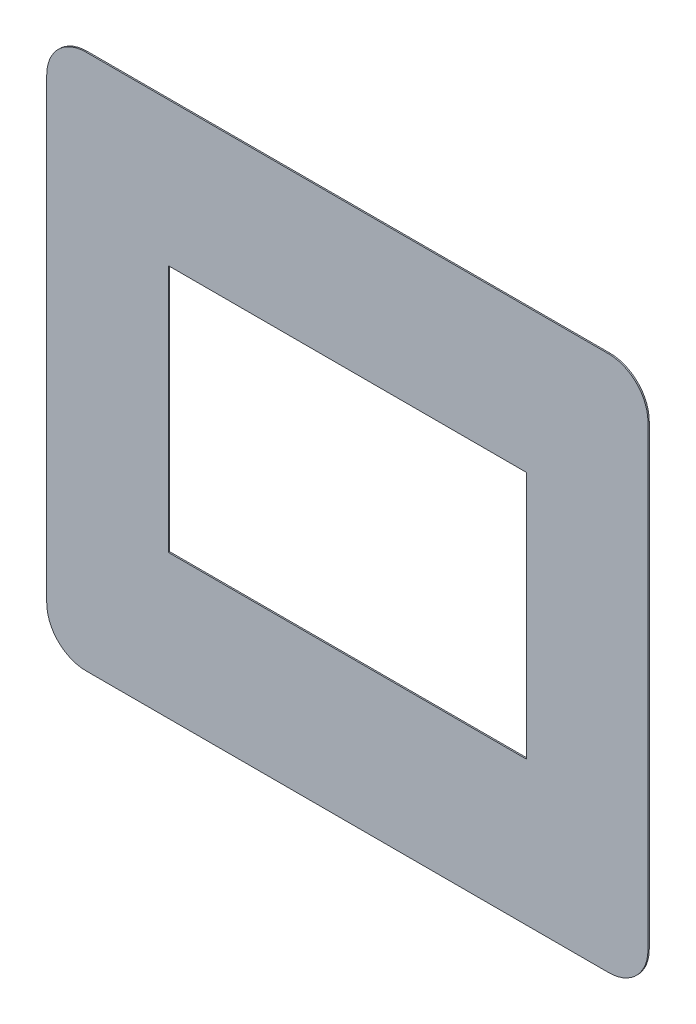
ISO-10303-21;
HEADER;
FILE_DESCRIPTION(('STEP AP214'),'2;1');
FILE_NAME('part.step','',(''),(''),'','','');
FILE_SCHEMA(('AUTOMOTIVE_DESIGN { 1 0 10303 214 1 1 1 1 }'));
ENDSEC;
DATA;
#1=APPLICATION_CONTEXT('core data for automotive mechanical design processes');
#2=APPLICATION_PROTOCOL_DEFINITION('international standard','automotive_design',2000,#1);
#3=PRODUCT_CONTEXT('',#1,'mechanical');
#4=PRODUCT('Part','Part','',(#3));
#5=PRODUCT_RELATED_PRODUCT_CATEGORY('part','',(#4));
#6=PRODUCT_DEFINITION_FORMATION('','',#4);
#7=PRODUCT_DEFINITION_CONTEXT('part definition',#1,'design');
#8=PRODUCT_DEFINITION('design','',#6,#7);
#9=PRODUCT_DEFINITION_SHAPE('','',#8);
#10=(LENGTH_UNIT() NAMED_UNIT(*) SI_UNIT(.MILLI.,.METRE.));
#11=(NAMED_UNIT(*) PLANE_ANGLE_UNIT() SI_UNIT($,.RADIAN.));
#12=(NAMED_UNIT(*) SI_UNIT($,.STERADIAN.) SOLID_ANGLE_UNIT());
#13=UNCERTAINTY_MEASURE_WITH_UNIT(LENGTH_MEASURE(1.E-05),#10,'distance_accuracy_value','');
#14=(GEOMETRIC_REPRESENTATION_CONTEXT(3) GLOBAL_UNCERTAINTY_ASSIGNED_CONTEXT((#13)) GLOBAL_UNIT_ASSIGNED_CONTEXT((#10,
#11,#12)) REPRESENTATION_CONTEXT('',''));
#15=CARTESIAN_POINT('',(0.,0.,0.));
#16=DIRECTION('',(0.,0.,1.));
#17=DIRECTION('',(1.,0.,0.));
#18=AXIS2_PLACEMENT_3D('',#15,#16,#17);
#19=CARTESIAN_POINT('',(-19.1581938186555,19.0251729813199,0.1));
#20=DIRECTION('',(0.,0.,-1.));
#21=DIRECTION('',(-1.,0.,0.));
#22=AXIS2_PLACEMENT_3D('',#19,#20,#21);
#23=CYLINDRICAL_SURFACE('',#22,2.99999999999991);
#24=CARTESIAN_POINT('',(-19.1581938186555,19.0251729813199,0.));
#25=DIRECTION('',(0.,0.,1.));
#26=DIRECTION('',(-1.,0.,0.));
#27=AXIS2_PLACEMENT_3D('',#24,#25,#26);
#28=CIRCLE('',#27,2.99999999999991);
#29=CARTESIAN_POINT('',(-19.1581938186555,22.0251729813198,0.));
#30=VERTEX_POINT('',#29);
#31=CARTESIAN_POINT('',(-22.1581938186554,19.0251729813199,0.));
#32=VERTEX_POINT('',#31);
#33=EDGE_CURVE('E161',#30,#32,#28,.T.);
#34=ORIENTED_EDGE('',*,*,#33,.T.);
#35=DIRECTION('',(0.,0.,-1.));
#36=VECTOR('',#35,1.);
#37=CARTESIAN_POINT('',(-22.1581938186554,19.0251729813199,0.1));
#38=LINE('',#37,#36);
#39=CARTESIAN_POINT('',(-22.1581938186554,19.0251729813199,0.1));
#40=VERTEX_POINT('',#39);
#41=EDGE_CURVE('E245',#40,#32,#38,.T.);
#42=ORIENTED_EDGE('',*,*,#41,.F.);
#43=CARTESIAN_POINT('',(-19.1581938186555,19.0251729813199,0.1));
#44=DIRECTION('',(0.,0.,1.));
#45=DIRECTION('',(-1.,0.,0.));
#46=AXIS2_PLACEMENT_3D('',#43,#44,#45);
#47=CIRCLE('',#46,2.99999999999991);
#48=CARTESIAN_POINT('',(-19.1581938186555,22.0251729813198,0.1));
#49=VERTEX_POINT('',#48);
#50=EDGE_CURVE('E168',#49,#40,#47,.T.);
#51=ORIENTED_EDGE('',*,*,#50,.F.);
#52=DIRECTION('',(0.,0.,-1.));
#53=VECTOR('',#52,1.);
#54=CARTESIAN_POINT('',(-19.1581938186555,22.0251729813198,0.1));
#55=LINE('',#54,#53);
#56=EDGE_CURVE('E194',#49,#30,#55,.T.);
#57=ORIENTED_EDGE('',*,*,#56,.T.);
#58=EDGE_LOOP('',(#34,#42,#51,#57));
#59=FACE_BOUND('',#58,.T.);
#60=ADVANCED_FACE('F43',(#59),#23,.T.);
#61=CARTESIAN_POINT('',(-22.1581938186554,19.0251729813199,0.1));
#62=DIRECTION('',(1.,0.,0.));
#63=DIRECTION('',(0.,1.,0.));
#64=AXIS2_PLACEMENT_3D('',#61,#62,#63);
#65=PLANE('',#64);
#66=DIRECTION('',(0.,-1.,0.));
#67=VECTOR('',#66,1.);
#68=CARTESIAN_POINT('',(-22.1581938186554,19.0251729813199,0.));
#69=LINE('',#68,#67);
#70=CARTESIAN_POINT('',(-22.1581938186554,-15.9748270186802,0.));
#71=VERTEX_POINT('',#70);
#72=EDGE_CURVE('E198',#32,#71,#69,.T.);
#73=ORIENTED_EDGE('',*,*,#72,.T.);
#74=DIRECTION('',(0.,0.,-1.));
#75=VECTOR('',#74,1.);
#76=CARTESIAN_POINT('',(-22.1581938186554,-15.9748270186802,0.1));
#77=LINE('',#76,#75);
#78=CARTESIAN_POINT('',(-22.1581938186554,-15.9748270186802,0.1));
#79=VERTEX_POINT('',#78);
#80=EDGE_CURVE('E241',#79,#71,#77,.T.);
#81=ORIENTED_EDGE('',*,*,#80,.F.);
#82=DIRECTION('',(0.,-1.,0.));
#83=VECTOR('',#82,1.);
#84=CARTESIAN_POINT('',(-22.1581938186554,19.0251729813199,0.1));
#85=LINE('',#84,#83);
#86=EDGE_CURVE('E172',#40,#79,#85,.T.);
#87=ORIENTED_EDGE('',*,*,#86,.F.);
#88=ORIENTED_EDGE('',*,*,#41,.T.);
#89=EDGE_LOOP('',(#73,#81,#87,#88));
#90=FACE_BOUND('',#89,.T.);
#91=ADVANCED_FACE('F272',(#90),#65,.F.);
#92=CARTESIAN_POINT('',(-19.1581938186554,-15.9748270186802,0.1));
#93=DIRECTION('',(0.,0.,-1.));
#94=DIRECTION('',(-1.,0.,0.));
#95=AXIS2_PLACEMENT_3D('',#92,#93,#94);
#96=CYLINDRICAL_SURFACE('',#95,3.);
#97=CARTESIAN_POINT('',(-19.1581938186554,-15.9748270186802,0.));
#98=DIRECTION('',(0.,0.,1.));
#99=DIRECTION('',(-1.,0.,0.));
#100=AXIS2_PLACEMENT_3D('',#97,#98,#99);
#101=CIRCLE('',#100,3.);
#102=CARTESIAN_POINT('',(-19.1581938186554,-18.9748270186802,0.));
#103=VERTEX_POINT('',#102);
#104=EDGE_CURVE('E201',#71,#103,#101,.T.);
#105=ORIENTED_EDGE('',*,*,#104,.T.);
#106=DIRECTION('',(0.,0.,-1.));
#107=VECTOR('',#106,1.);
#108=CARTESIAN_POINT('',(-19.1581938186554,-18.9748270186802,0.1));
#109=LINE('',#108,#107);
#110=CARTESIAN_POINT('',(-19.1581938186554,-18.9748270186802,0.1));
#111=VERTEX_POINT('',#110);
#112=EDGE_CURVE('E237',#111,#103,#109,.T.);
#113=ORIENTED_EDGE('',*,*,#112,.F.);
#114=CARTESIAN_POINT('',(-19.1581938186554,-15.9748270186802,0.1));
#115=DIRECTION('',(0.,0.,1.));
#116=DIRECTION('',(-1.,0.,0.));
#117=AXIS2_PLACEMENT_3D('',#114,#115,#116);
#118=CIRCLE('',#117,3.);
#119=EDGE_CURVE('E176',#79,#111,#118,.T.);
#120=ORIENTED_EDGE('',*,*,#119,.F.);
#121=ORIENTED_EDGE('',*,*,#80,.T.);
#122=EDGE_LOOP('',(#105,#113,#120,#121));
#123=FACE_BOUND('',#122,.T.);
#124=ADVANCED_FACE('F277',(#123),#96,.T.);
#125=CARTESIAN_POINT('',(-19.1581938186554,-18.9748270186802,0.1));
#126=DIRECTION('',(0.,1.,0.));
#127=DIRECTION('',(0.,0.,1.));
#128=AXIS2_PLACEMENT_3D('',#125,#126,#127);
#129=PLANE('',#128);
#130=DIRECTION('',(1.,0.,0.));
#131=VECTOR('',#130,1.);
#132=CARTESIAN_POINT('',(-19.1581938186554,-18.9748270186802,0.));
#133=LINE('',#132,#131);
#134=CARTESIAN_POINT('',(20.8418061813446,-18.9748270186802,0.));
#135=VERTEX_POINT('',#134);
#136=EDGE_CURVE('E204',#103,#135,#133,.T.);
#137=ORIENTED_EDGE('',*,*,#136,.T.);
#138=DIRECTION('',(0.,0.,-1.));
#139=VECTOR('',#138,1.);
#140=CARTESIAN_POINT('',(20.8418061813446,-18.9748270186802,0.1));
#141=LINE('',#140,#139);
#142=CARTESIAN_POINT('',(20.8418061813446,-18.9748270186802,0.1));
#143=VERTEX_POINT('',#142);
#144=EDGE_CURVE('E233',#143,#135,#141,.T.);
#145=ORIENTED_EDGE('',*,*,#144,.F.);
#146=DIRECTION('',(1.,0.,0.));
#147=VECTOR('',#146,1.);
#148=CARTESIAN_POINT('',(-19.1581938186554,-18.9748270186802,0.1));
#149=LINE('',#148,#147);
#150=EDGE_CURVE('E179',#111,#143,#149,.T.);
#151=ORIENTED_EDGE('',*,*,#150,.F.);
#152=ORIENTED_EDGE('',*,*,#112,.T.);
#153=EDGE_LOOP('',(#137,#145,#151,#152));
#154=FACE_BOUND('',#153,.T.);
#155=ADVANCED_FACE('F309',(#154),#129,.F.);
#156=CARTESIAN_POINT('',(20.8418061813446,-15.9748270186802,0.1));
#157=DIRECTION('',(0.,0.,-1.));
#158=DIRECTION('',(-1.,0.,0.));
#159=AXIS2_PLACEMENT_3D('',#156,#157,#158);
#160=CYLINDRICAL_SURFACE('',#159,3.00000000000001);
#161=CARTESIAN_POINT('',(20.8418061813446,-15.9748270186802,0.));
#162=DIRECTION('',(0.,0.,1.));
#163=DIRECTION('',(-1.,0.,0.));
#164=AXIS2_PLACEMENT_3D('',#161,#162,#163);
#165=CIRCLE('',#164,3.00000000000001);
#166=CARTESIAN_POINT('',(23.8418061813446,-15.9748270186802,0.));
#167=VERTEX_POINT('',#166);
#168=EDGE_CURVE('E207',#135,#167,#165,.T.);
#169=ORIENTED_EDGE('',*,*,#168,.T.);
#170=DIRECTION('',(0.,0.,-1.));
#171=VECTOR('',#170,1.);
#172=CARTESIAN_POINT('',(23.8418061813446,-15.9748270186802,0.1));
#173=LINE('',#172,#171);
#174=CARTESIAN_POINT('',(23.8418061813446,-15.9748270186802,0.1));
#175=VERTEX_POINT('',#174);
#176=EDGE_CURVE('E229',#175,#167,#173,.T.);
#177=ORIENTED_EDGE('',*,*,#176,.F.);
#178=CARTESIAN_POINT('',(20.8418061813446,-15.9748270186802,0.1));
#179=DIRECTION('',(0.,0.,1.));
#180=DIRECTION('',(-1.,0.,0.));
#181=AXIS2_PLACEMENT_3D('',#178,#179,#180);
#182=CIRCLE('',#181,3.00000000000001);
#183=EDGE_CURVE('E182',#143,#175,#182,.T.);
#184=ORIENTED_EDGE('',*,*,#183,.F.);
#185=ORIENTED_EDGE('',*,*,#144,.T.);
#186=EDGE_LOOP('',(#169,#177,#184,#185));
#187=FACE_BOUND('',#186,.T.);
#188=ADVANCED_FACE('F305',(#187),#160,.T.);
#189=CARTESIAN_POINT('',(23.8418061813446,-15.9748270186802,0.1));
#190=DIRECTION('',(-1.,0.,0.));
#191=DIRECTION('',(0.,0.,1.));
#192=AXIS2_PLACEMENT_3D('',#189,#190,#191);
#193=PLANE('',#192);
#194=DIRECTION('',(0.,1.,0.));
#195=VECTOR('',#194,1.);
#196=CARTESIAN_POINT('',(23.8418061813446,-15.9748270186802,0.));
#197=LINE('',#196,#195);
#198=CARTESIAN_POINT('',(23.8418061813446,19.0251729813198,0.));
#199=VERTEX_POINT('',#198);
#200=EDGE_CURVE('E210',#167,#199,#197,.T.);
#201=ORIENTED_EDGE('',*,*,#200,.T.);
#202=DIRECTION('',(0.,0.,-1.));
#203=VECTOR('',#202,1.);
#204=CARTESIAN_POINT('',(23.8418061813446,19.0251729813198,0.1));
#205=LINE('',#204,#203);
#206=CARTESIAN_POINT('',(23.8418061813446,19.0251729813198,0.1));
#207=VERTEX_POINT('',#206);
#208=EDGE_CURVE('E225',#207,#199,#205,.T.);
#209=ORIENTED_EDGE('',*,*,#208,.F.);
#210=DIRECTION('',(0.,1.,0.));
#211=VECTOR('',#210,1.);
#212=CARTESIAN_POINT('',(23.8418061813446,-15.9748270186802,0.1));
#213=LINE('',#212,#211);
#214=EDGE_CURVE('E185',#175,#207,#213,.T.);
#215=ORIENTED_EDGE('',*,*,#214,.F.);
#216=ORIENTED_EDGE('',*,*,#176,.T.);
#217=EDGE_LOOP('',(#201,#209,#215,#216));
#218=FACE_BOUND('',#217,.T.);
#219=ADVANCED_FACE('F300',(#218),#193,.F.);
#220=CARTESIAN_POINT('',(20.8418061813446,19.0251729813198,0.1));
#221=DIRECTION('',(0.,0.,-1.));
#222=DIRECTION('',(-1.,0.,0.));
#223=AXIS2_PLACEMENT_3D('',#220,#221,#222);
#224=CYLINDRICAL_SURFACE('',#223,3.00000000000004);
#225=CARTESIAN_POINT('',(20.8418061813446,19.0251729813198,0.));
#226=DIRECTION('',(0.,0.,1.));
#227=DIRECTION('',(-1.,0.,0.));
#228=AXIS2_PLACEMENT_3D('',#225,#226,#227);
#229=CIRCLE('',#228,3.00000000000004);
#230=CARTESIAN_POINT('',(20.8418061813446,22.0251729813198,0.));
#231=VERTEX_POINT('',#230);
#232=EDGE_CURVE('E213',#199,#231,#229,.T.);
#233=ORIENTED_EDGE('',*,*,#232,.T.);
#234=DIRECTION('',(0.,0.,-1.));
#235=VECTOR('',#234,1.);
#236=CARTESIAN_POINT('',(20.8418061813446,22.0251729813198,0.1));
#237=LINE('',#236,#235);
#238=CARTESIAN_POINT('',(20.8418061813446,22.0251729813198,0.1));
#239=VERTEX_POINT('',#238);
#240=EDGE_CURVE('E221',#239,#231,#237,.T.);
#241=ORIENTED_EDGE('',*,*,#240,.F.);
#242=CARTESIAN_POINT('',(20.8418061813446,19.0251729813198,0.1));
#243=DIRECTION('',(0.,0.,1.));
#244=DIRECTION('',(-1.,0.,0.));
#245=AXIS2_PLACEMENT_3D('',#242,#243,#244);
#246=CIRCLE('',#245,3.00000000000004);
#247=EDGE_CURVE('E188',#207,#239,#246,.T.);
#248=ORIENTED_EDGE('',*,*,#247,.F.);
#249=ORIENTED_EDGE('',*,*,#208,.T.);
#250=EDGE_LOOP('',(#233,#241,#248,#249));
#251=FACE_BOUND('',#250,.T.);
#252=ADVANCED_FACE('F295',(#251),#224,.T.);
#253=CARTESIAN_POINT('',(20.8418061813446,22.0251729813198,0.1));
#254=DIRECTION('',(0.,-1.,0.));
#255=DIRECTION('',(1.,0.,0.));
#256=AXIS2_PLACEMENT_3D('',#253,#254,#255);
#257=PLANE('',#256);
#258=DIRECTION('',(-1.,0.,0.));
#259=VECTOR('',#258,1.);
#260=CARTESIAN_POINT('',(20.8418061813446,22.0251729813198,0.));
#261=LINE('',#260,#259);
#262=EDGE_CURVE('E173',#231,#30,#261,.T.);
#263=ORIENTED_EDGE('',*,*,#262,.T.);
#264=ORIENTED_EDGE('',*,*,#56,.F.);
#265=DIRECTION('',(-1.,0.,0.));
#266=VECTOR('',#265,1.);
#267=CARTESIAN_POINT('',(20.8418061813446,22.0251729813198,0.1));
#268=LINE('',#267,#266);
#269=EDGE_CURVE('E191',#239,#49,#268,.T.);
#270=ORIENTED_EDGE('',*,*,#269,.F.);
#271=ORIENTED_EDGE('',*,*,#240,.T.);
#272=EDGE_LOOP('',(#263,#264,#270,#271));
#273=FACE_BOUND('',#272,.T.);
#274=ADVANCED_FACE('F293',(#273),#257,.F.);
#275=CARTESIAN_POINT('',(-19.1581938186555,19.0251729813199,0.1));
#276=DIRECTION('',(0.,0.,-1.));
#277=DIRECTION('',(-1.,0.,0.));
#278=AXIS2_PLACEMENT_3D('',#275,#276,#277);
#279=PLANE('',#278);
#280=DIRECTION('',(1.,0.,0.));
#281=VECTOR('',#280,1.);
#282=CARTESIAN_POINT('',(14.5418061813446,11.0251729813198,0.1));
#283=LINE('',#282,#281);
#284=CARTESIAN_POINT('',(-12.8581938186554,11.0251729813198,0.1));
#285=VERTEX_POINT('',#284);
#286=CARTESIAN_POINT('',(14.5418061813446,11.0251729813198,0.1));
#287=VERTEX_POINT('',#286);
#288=EDGE_CURVE('E140',#285,#287,#283,.T.);
#289=ORIENTED_EDGE('',*,*,#288,.T.);
#290=DIRECTION('',(0.,-1.,0.));
#291=VECTOR('',#290,1.);
#292=CARTESIAN_POINT('',(14.5418061813446,-7.97482701868017,0.1));
#293=LINE('',#292,#291);
#294=CARTESIAN_POINT('',(14.5418061813446,-7.97482701868017,0.1));
#295=VERTEX_POINT('',#294);
#296=EDGE_CURVE('E134',#287,#295,#293,.T.);
#297=ORIENTED_EDGE('',*,*,#296,.T.);
#298=DIRECTION('',(-1.,0.,0.));
#299=VECTOR('',#298,1.);
#300=CARTESIAN_POINT('',(-12.8581938186554,-7.97482701868016,0.1));
#301=LINE('',#300,#299);
#302=CARTESIAN_POINT('',(-12.8581938186554,-7.97482701868016,0.1));
#303=VERTEX_POINT('',#302);
#304=EDGE_CURVE('E143',#295,#303,#301,.T.);
#305=ORIENTED_EDGE('',*,*,#304,.T.);
#306=DIRECTION('',(0.,1.,0.));
#307=VECTOR('',#306,1.);
#308=CARTESIAN_POINT('',(-12.8581938186554,11.0251729813198,0.1));
#309=LINE('',#308,#307);
#310=EDGE_CURVE('E58',#303,#285,#309,.T.);
#311=ORIENTED_EDGE('',*,*,#310,.T.);
#312=EDGE_LOOP('',(#289,#297,#305,#311));
#313=FACE_BOUND('',#312,.T.);
#314=ORIENTED_EDGE('',*,*,#50,.T.);
#315=ORIENTED_EDGE('',*,*,#86,.T.);
#316=ORIENTED_EDGE('',*,*,#119,.T.);
#317=ORIENTED_EDGE('',*,*,#150,.T.);
#318=ORIENTED_EDGE('',*,*,#183,.T.);
#319=ORIENTED_EDGE('',*,*,#214,.T.);
#320=ORIENTED_EDGE('',*,*,#247,.T.);
#321=ORIENTED_EDGE('',*,*,#269,.T.);
#322=EDGE_LOOP('',(#314,#315,#316,#317,#318,#319,#320,#321));
#323=FACE_BOUND('',#322,.T.);
#324=ADVANCED_FACE('F148',(#313,#323),#279,.F.);
#325=CARTESIAN_POINT('',(-19.1581938186555,19.0251729813199,0.));
#326=DIRECTION('',(0.,0.,-1.));
#327=DIRECTION('',(-1.,0.,0.));
#328=AXIS2_PLACEMENT_3D('',#325,#326,#327);
#329=PLANE('',#328);
#330=DIRECTION('',(0.,-1.,0.));
#331=VECTOR('',#330,1.);
#332=CARTESIAN_POINT('',(14.5418061813446,19.0251729813199,0.));
#333=LINE('',#332,#331);
#334=CARTESIAN_POINT('',(14.5418061813446,11.0251729813198,0.));
#335=VERTEX_POINT('',#334);
#336=CARTESIAN_POINT('',(14.5418061813446,-7.97482701868017,0.));
#337=VERTEX_POINT('',#336);
#338=EDGE_CURVE('E11',#335,#337,#333,.T.);
#339=ORIENTED_EDGE('',*,*,#338,.F.);
#340=DIRECTION('',(1.,0.,0.));
#341=VECTOR('',#340,1.);
#342=CARTESIAN_POINT('',(-19.1581938186555,11.0251729813198,0.));
#343=LINE('',#342,#341);
#344=CARTESIAN_POINT('',(-12.8581938186554,11.0251729813198,0.));
#345=VERTEX_POINT('',#344);
#346=EDGE_CURVE('E51',#345,#335,#343,.T.);
#347=ORIENTED_EDGE('',*,*,#346,.F.);
#348=DIRECTION('',(0.,1.,0.));
#349=VECTOR('',#348,1.);
#350=CARTESIAN_POINT('',(-12.8581938186554,19.0251729813199,0.));
#351=LINE('',#350,#349);
#352=CARTESIAN_POINT('',(-12.8581938186554,-7.97482701868016,0.));
#353=VERTEX_POINT('',#352);
#354=EDGE_CURVE('E252',#353,#345,#351,.T.);
#355=ORIENTED_EDGE('',*,*,#354,.F.);
#356=DIRECTION('',(-1.,0.,0.));
#357=VECTOR('',#356,1.);
#358=CARTESIAN_POINT('',(-19.1581938186555,-7.97482701868016,0.));
#359=LINE('',#358,#357);
#360=EDGE_CURVE('E249',#337,#353,#359,.T.);
#361=ORIENTED_EDGE('',*,*,#360,.F.);
#362=EDGE_LOOP('',(#339,#347,#355,#361));
#363=FACE_BOUND('',#362,.T.);
#364=ORIENTED_EDGE('',*,*,#33,.F.);
#365=ORIENTED_EDGE('',*,*,#262,.F.);
#366=ORIENTED_EDGE('',*,*,#232,.F.);
#367=ORIENTED_EDGE('',*,*,#200,.F.);
#368=ORIENTED_EDGE('',*,*,#168,.F.);
#369=ORIENTED_EDGE('',*,*,#136,.F.);
#370=ORIENTED_EDGE('',*,*,#104,.F.);
#371=ORIENTED_EDGE('',*,*,#72,.F.);
#372=EDGE_LOOP('',(#364,#365,#366,#367,#368,#369,#370,#371));
#373=FACE_BOUND('',#372,.T.);
#374=ADVANCED_FACE('F260',(#363,#373),#329,.T.);
#375=CARTESIAN_POINT('',(14.5418061813446,-7.97482701868017,0.1));
#376=DIRECTION('',(1.,0.,0.));
#377=DIRECTION('',(0.,0.,-1.));
#378=AXIS2_PLACEMENT_3D('',#375,#376,#377);
#379=PLANE('',#378);
#380=ORIENTED_EDGE('',*,*,#338,.T.);
#381=DIRECTION('',(0.,0.,-1.));
#382=VECTOR('',#381,1.);
#383=CARTESIAN_POINT('',(14.5418061813446,-7.97482701868017,0.1));
#384=LINE('',#383,#382);
#385=EDGE_CURVE('E66',#295,#337,#384,.T.);
#386=ORIENTED_EDGE('',*,*,#385,.F.);
#387=ORIENTED_EDGE('',*,*,#296,.F.);
#388=DIRECTION('',(0.,0.,-1.));
#389=VECTOR('',#388,1.);
#390=CARTESIAN_POINT('',(14.5418061813446,11.0251729813198,0.1));
#391=LINE('',#390,#389);
#392=EDGE_CURVE('E158',#287,#335,#391,.T.);
#393=ORIENTED_EDGE('',*,*,#392,.T.);
#394=EDGE_LOOP('',(#380,#386,#387,#393));
#395=FACE_BOUND('',#394,.T.);
#396=ADVANCED_FACE('F131',(#395),#379,.F.);
#397=CARTESIAN_POINT('',(14.5418061813446,11.0251729813198,0.1));
#398=DIRECTION('',(0.,1.,0.));
#399=DIRECTION('',(0.,0.,1.));
#400=AXIS2_PLACEMENT_3D('',#397,#398,#399);
#401=PLANE('',#400);
#402=ORIENTED_EDGE('',*,*,#346,.T.);
#403=ORIENTED_EDGE('',*,*,#392,.F.);
#404=ORIENTED_EDGE('',*,*,#288,.F.);
#405=DIRECTION('',(0.,0.,-1.));
#406=VECTOR('',#405,1.);
#407=CARTESIAN_POINT('',(-12.8581938186554,11.0251729813198,0.1));
#408=LINE('',#407,#406);
#409=EDGE_CURVE('E162',#285,#345,#408,.T.);
#410=ORIENTED_EDGE('',*,*,#409,.T.);
#411=EDGE_LOOP('',(#402,#403,#404,#410));
#412=FACE_BOUND('',#411,.T.);
#413=ADVANCED_FACE('F257',(#412),#401,.F.);
#414=CARTESIAN_POINT('',(-12.8581938186554,11.0251729813198,0.1));
#415=DIRECTION('',(-1.,0.,0.));
#416=DIRECTION('',(0.,-1.,0.));
#417=AXIS2_PLACEMENT_3D('',#414,#415,#416);
#418=PLANE('',#417);
#419=ORIENTED_EDGE('',*,*,#354,.T.);
#420=ORIENTED_EDGE('',*,*,#409,.F.);
#421=ORIENTED_EDGE('',*,*,#310,.F.);
#422=DIRECTION('',(0.,0.,-1.));
#423=VECTOR('',#422,1.);
#424=CARTESIAN_POINT('',(-12.8581938186554,-7.97482701868016,0.1));
#425=LINE('',#424,#423);
#426=EDGE_CURVE('E139',#303,#353,#425,.T.);
#427=ORIENTED_EDGE('',*,*,#426,.T.);
#428=EDGE_LOOP('',(#419,#420,#421,#427));
#429=FACE_BOUND('',#428,.T.);
#430=ADVANCED_FACE('F262',(#429),#418,.F.);
#431=CARTESIAN_POINT('',(-12.8581938186554,-7.97482701868016,0.1));
#432=DIRECTION('',(0.,-1.,0.));
#433=DIRECTION('',(1.,0.,0.));
#434=AXIS2_PLACEMENT_3D('',#431,#432,#433);
#435=PLANE('',#434);
#436=ORIENTED_EDGE('',*,*,#360,.T.);
#437=ORIENTED_EDGE('',*,*,#426,.F.);
#438=ORIENTED_EDGE('',*,*,#304,.F.);
#439=ORIENTED_EDGE('',*,*,#385,.T.);
#440=EDGE_LOOP('',(#436,#437,#438,#439));
#441=FACE_BOUND('',#440,.T.);
#442=ADVANCED_FACE('F144',(#441),#435,.F.);
#443=CLOSED_SHELL('',(#60,#91,#124,#155,#188,#219,#252,#274,#324,#374,#396,#413,#430,#442));
#444=MANIFOLD_SOLID_BREP('B2',#443);
#445=ADVANCED_BREP_SHAPE_REPRESENTATION('',(#18,#444),#14);
#446=SHAPE_DEFINITION_REPRESENTATION(#9,#445);
ENDSEC;
END-ISO-10303-21;
